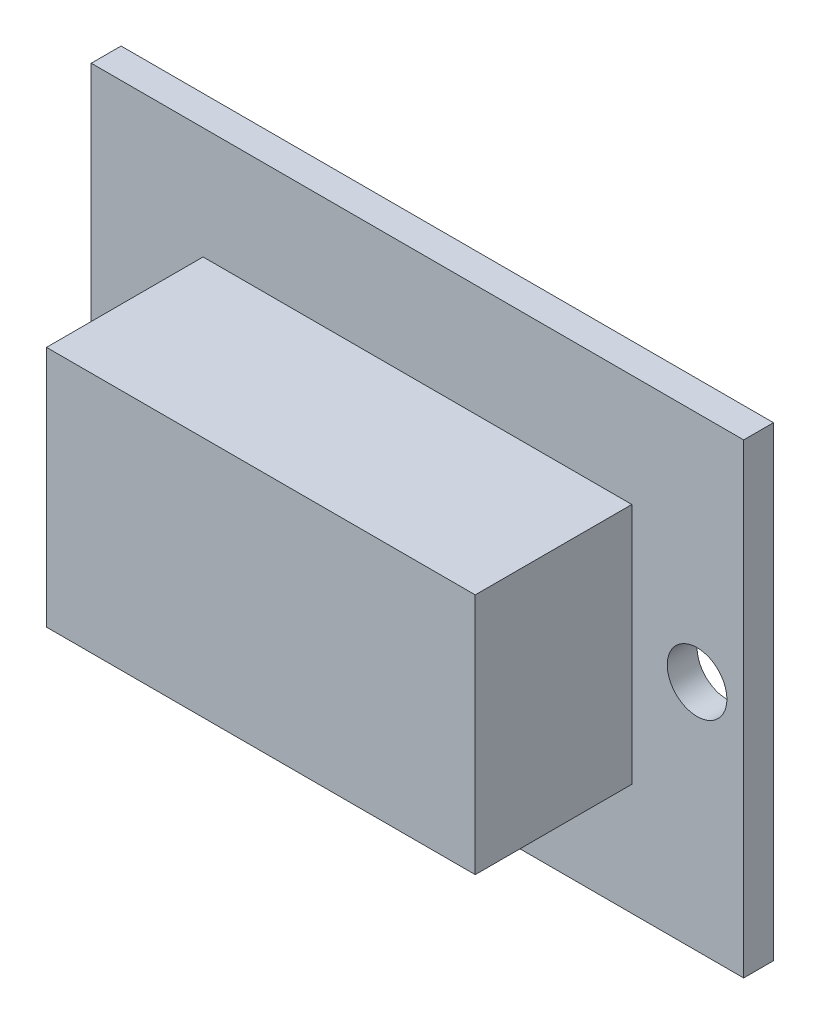
ISO-10303-21;
HEADER;
FILE_DESCRIPTION(('STEP AP214'),'2;1');
FILE_NAME('part.step','',(''),(''),'','','');
FILE_SCHEMA(('AUTOMOTIVE_DESIGN { 1 0 10303 214 1 1 1 1 }'));
ENDSEC;
DATA;
#1=APPLICATION_CONTEXT('core data for automotive mechanical design processes');
#2=APPLICATION_PROTOCOL_DEFINITION('international standard','automotive_design',2000,#1);
#3=PRODUCT_CONTEXT('',#1,'mechanical');
#4=PRODUCT('Part','Part','',(#3));
#5=PRODUCT_RELATED_PRODUCT_CATEGORY('part','',(#4));
#6=PRODUCT_DEFINITION_FORMATION('','',#4);
#7=PRODUCT_DEFINITION_CONTEXT('part definition',#1,'design');
#8=PRODUCT_DEFINITION('design','',#6,#7);
#9=PRODUCT_DEFINITION_SHAPE('','',#8);
#10=(LENGTH_UNIT() NAMED_UNIT(*) SI_UNIT(.MILLI.,.METRE.));
#11=(NAMED_UNIT(*) PLANE_ANGLE_UNIT() SI_UNIT($,.RADIAN.));
#12=(NAMED_UNIT(*) SI_UNIT($,.STERADIAN.) SOLID_ANGLE_UNIT());
#13=UNCERTAINTY_MEASURE_WITH_UNIT(LENGTH_MEASURE(1.E-05),#10,'distance_accuracy_value','');
#14=(GEOMETRIC_REPRESENTATION_CONTEXT(3) GLOBAL_UNCERTAINTY_ASSIGNED_CONTEXT((#13)) GLOBAL_UNIT_ASSIGNED_CONTEXT((#10,
#11,#12)) REPRESENTATION_CONTEXT('',''));
#15=CARTESIAN_POINT('',(0.,0.,0.));
#16=DIRECTION('',(0.,0.,1.));
#17=DIRECTION('',(1.,0.,0.));
#18=AXIS2_PLACEMENT_3D('',#15,#16,#17);
#19=CARTESIAN_POINT('',(-11.5,-6.5,10.));
#20=DIRECTION('',(0.,0.,1.));
#21=DIRECTION('',(1.,0.,0.));
#22=AXIS2_PLACEMENT_3D('',#19,#20,#21);
#23=PLANE('',#22);
#24=DIRECTION('',(0.,1.,0.));
#25=VECTOR('',#24,1.);
#26=CARTESIAN_POINT('',(-11.5,-6.5,10.));
#27=LINE('',#26,#25);
#28=CARTESIAN_POINT('',(-11.5,-6.5,10.));
#29=VERTEX_POINT('',#28);
#30=CARTESIAN_POINT('',(-11.5,6.5,10.));
#31=VERTEX_POINT('',#30);
#32=EDGE_CURVE('E212',#29,#31,#27,.T.);
#33=ORIENTED_EDGE('',*,*,#32,.F.);
#34=DIRECTION('',(1.,0.,0.));
#35=VECTOR('',#34,1.);
#36=CARTESIAN_POINT('',(-11.5,-6.5,10.));
#37=LINE('',#36,#35);
#38=CARTESIAN_POINT('',(11.5,-6.5,10.));
#39=VERTEX_POINT('',#38);
#40=EDGE_CURVE('E145',#29,#39,#37,.T.);
#41=ORIENTED_EDGE('',*,*,#40,.T.);
#42=DIRECTION('',(0.,1.,0.));
#43=VECTOR('',#42,1.);
#44=CARTESIAN_POINT('',(11.5,-6.5,10.));
#45=LINE('',#44,#43);
#46=CARTESIAN_POINT('',(11.5,6.5,10.));
#47=VERTEX_POINT('',#46);
#48=EDGE_CURVE('E46',#39,#47,#45,.T.);
#49=ORIENTED_EDGE('',*,*,#48,.T.);
#50=DIRECTION('',(1.,0.,0.));
#51=VECTOR('',#50,1.);
#52=CARTESIAN_POINT('',(-11.5,6.5,10.));
#53=LINE('',#52,#51);
#54=EDGE_CURVE('E23',#31,#47,#53,.T.);
#55=ORIENTED_EDGE('',*,*,#54,.F.);
#56=EDGE_LOOP('',(#33,#41,#49,#55));
#57=FACE_BOUND('',#56,.T.);
#58=ADVANCED_FACE('F14',(#57),#23,.T.);
#59=CARTESIAN_POINT('',(15.,0.,-2.5));
#60=DIRECTION('',(0.,0.,1.));
#61=DIRECTION('',(1.,0.,0.));
#62=AXIS2_PLACEMENT_3D('',#59,#60,#61);
#63=CYLINDRICAL_SURFACE('',#62,1.6);
#64=DIRECTION('',(0.,0.,1.));
#65=VECTOR('',#64,1.);
#66=CARTESIAN_POINT('',(16.6,0.,-2.5));
#67=LINE('',#66,#65);
#68=CARTESIAN_POINT('',(16.6,0.,0.));
#69=VERTEX_POINT('',#68);
#70=CARTESIAN_POINT('',(16.6,0.,1.6));
#71=VERTEX_POINT('',#70);
#72=EDGE_CURVE('E9',#69,#71,#67,.T.);
#73=ORIENTED_EDGE('',*,*,#72,.F.);
#74=CARTESIAN_POINT('',(15.,0.,0.));
#75=DIRECTION('',(0.,0.,1.));
#76=DIRECTION('',(1.,0.,0.));
#77=AXIS2_PLACEMENT_3D('',#74,#75,#76);
#78=CIRCLE('',#77,1.6);
#79=EDGE_CURVE('E201',#69,#69,#78,.T.);
#80=ORIENTED_EDGE('',*,*,#79,.F.);
#81=ORIENTED_EDGE('',*,*,#72,.T.);
#82=CARTESIAN_POINT('',(15.,0.,1.6));
#83=DIRECTION('',(0.,0.,1.));
#84=DIRECTION('',(1.,0.,0.));
#85=AXIS2_PLACEMENT_3D('',#82,#83,#84);
#86=CIRCLE('',#85,1.6);
#87=EDGE_CURVE('E179',#71,#71,#86,.T.);
#88=ORIENTED_EDGE('',*,*,#87,.T.);
#89=EDGE_LOOP('',(#73,#80,#81,#88));
#90=FACE_BOUND('',#89,.T.);
#91=ADVANCED_FACE('F264',(#90),#63,.F.);
#92=CARTESIAN_POINT('',(-11.5,6.5,1.6));
#93=DIRECTION('',(0.,1.,0.));
#94=DIRECTION('',(1.,0.,0.));
#95=AXIS2_PLACEMENT_3D('',#92,#93,#94);
#96=PLANE('',#95);
#97=DIRECTION('',(1.,0.,0.));
#98=VECTOR('',#97,1.);
#99=CARTESIAN_POINT('',(-11.5,6.5,1.6));
#100=LINE('',#99,#98);
#101=CARTESIAN_POINT('',(-11.5,6.5,1.6));
#102=VERTEX_POINT('',#101);
#103=CARTESIAN_POINT('',(11.5,6.5,1.6));
#104=VERTEX_POINT('',#103);
#105=EDGE_CURVE('E142',#102,#104,#100,.T.);
#106=ORIENTED_EDGE('',*,*,#105,.F.);
#107=DIRECTION('',(0.,0.,1.));
#108=VECTOR('',#107,1.);
#109=CARTESIAN_POINT('',(-11.5,6.5,1.6));
#110=LINE('',#109,#108);
#111=EDGE_CURVE('E209',#102,#31,#110,.T.);
#112=ORIENTED_EDGE('',*,*,#111,.T.);
#113=ORIENTED_EDGE('',*,*,#54,.T.);
#114=DIRECTION('',(0.,0.,1.));
#115=VECTOR('',#114,1.);
#116=CARTESIAN_POINT('',(11.5,6.5,1.6));
#117=LINE('',#116,#115);
#118=EDGE_CURVE('E17',#104,#47,#117,.T.);
#119=ORIENTED_EDGE('',*,*,#118,.F.);
#120=EDGE_LOOP('',(#106,#112,#113,#119));
#121=FACE_BOUND('',#120,.T.);
#122=ADVANCED_FACE('F140',(#121),#96,.T.);
#123=CARTESIAN_POINT('',(11.5,-6.5,1.6));
#124=DIRECTION('',(1.,0.,0.));
#125=DIRECTION('',(0.,1.,0.));
#126=AXIS2_PLACEMENT_3D('',#123,#124,#125);
#127=PLANE('',#126);
#128=DIRECTION('',(0.,0.,1.));
#129=VECTOR('',#128,1.);
#130=CARTESIAN_POINT('',(11.5,-6.5,1.6));
#131=LINE('',#130,#129);
#132=CARTESIAN_POINT('',(11.5,-6.5,1.6));
#133=VERTEX_POINT('',#132);
#134=EDGE_CURVE('E134',#133,#39,#131,.T.);
#135=ORIENTED_EDGE('',*,*,#134,.F.);
#136=DIRECTION('',(0.,1.,0.));
#137=VECTOR('',#136,1.);
#138=CARTESIAN_POINT('',(11.5,-6.5,1.6));
#139=LINE('',#138,#137);
#140=EDGE_CURVE('E147',#133,#104,#139,.T.);
#141=ORIENTED_EDGE('',*,*,#140,.T.);
#142=ORIENTED_EDGE('',*,*,#118,.T.);
#143=ORIENTED_EDGE('',*,*,#48,.F.);
#144=EDGE_LOOP('',(#135,#141,#142,#143));
#145=FACE_BOUND('',#144,.T.);
#146=ADVANCED_FACE('F148',(#145),#127,.T.);
#147=CARTESIAN_POINT('',(-11.5,-6.5,1.6));
#148=DIRECTION('',(0.,1.,0.));
#149=DIRECTION('',(1.,0.,0.));
#150=AXIS2_PLACEMENT_3D('',#147,#148,#149);
#151=PLANE('',#150);
#152=ORIENTED_EDGE('',*,*,#134,.T.);
#153=ORIENTED_EDGE('',*,*,#40,.F.);
#154=DIRECTION('',(0.,0.,1.));
#155=VECTOR('',#154,1.);
#156=CARTESIAN_POINT('',(-11.5,-6.5,1.6));
#157=LINE('',#156,#155);
#158=CARTESIAN_POINT('',(-11.5,-6.5,1.6));
#159=VERTEX_POINT('',#158);
#160=EDGE_CURVE('E205',#159,#29,#157,.T.);
#161=ORIENTED_EDGE('',*,*,#160,.F.);
#162=DIRECTION('',(1.,0.,0.));
#163=VECTOR('',#162,1.);
#164=CARTESIAN_POINT('',(-11.5,-6.5,1.6));
#165=LINE('',#164,#163);
#166=EDGE_CURVE('E152',#159,#133,#165,.T.);
#167=ORIENTED_EDGE('',*,*,#166,.T.);
#168=EDGE_LOOP('',(#152,#153,#161,#167));
#169=FACE_BOUND('',#168,.T.);
#170=ADVANCED_FACE('F248',(#169),#151,.F.);
#171=CARTESIAN_POINT('',(-11.5,-6.5,1.6));
#172=DIRECTION('',(1.,0.,0.));
#173=DIRECTION('',(0.,1.,0.));
#174=AXIS2_PLACEMENT_3D('',#171,#172,#173);
#175=PLANE('',#174);
#176=ORIENTED_EDGE('',*,*,#32,.T.);
#177=ORIENTED_EDGE('',*,*,#111,.F.);
#178=DIRECTION('',(0.,1.,0.));
#179=VECTOR('',#178,1.);
#180=CARTESIAN_POINT('',(-11.5,-6.5,1.6));
#181=LINE('',#180,#179);
#182=EDGE_CURVE('E157',#159,#102,#181,.T.);
#183=ORIENTED_EDGE('',*,*,#182,.F.);
#184=ORIENTED_EDGE('',*,*,#160,.T.);
#185=EDGE_LOOP('',(#176,#177,#183,#184));
#186=FACE_BOUND('',#185,.T.);
#187=ADVANCED_FACE('F244',(#186),#175,.F.);
#188=CARTESIAN_POINT('',(-15.,0.,-2.5));
#189=DIRECTION('',(0.,0.,1.));
#190=DIRECTION('',(1.,0.,0.));
#191=AXIS2_PLACEMENT_3D('',#188,#189,#190);
#192=CYLINDRICAL_SURFACE('',#191,1.6);
#193=DIRECTION('',(0.,0.,1.));
#194=VECTOR('',#193,1.);
#195=CARTESIAN_POINT('',(-13.4,0.,-2.5));
#196=LINE('',#195,#194);
#197=CARTESIAN_POINT('',(-13.4,0.,0.));
#198=VERTEX_POINT('',#197);
#199=CARTESIAN_POINT('',(-13.4,0.,1.6));
#200=VERTEX_POINT('',#199);
#201=EDGE_CURVE('E122',#198,#200,#196,.T.);
#202=ORIENTED_EDGE('',*,*,#201,.F.);
#203=CARTESIAN_POINT('',(-15.,0.,0.));
#204=DIRECTION('',(0.,0.,1.));
#205=DIRECTION('',(1.,0.,0.));
#206=AXIS2_PLACEMENT_3D('',#203,#204,#205);
#207=CIRCLE('',#206,1.6);
#208=EDGE_CURVE('E204',#198,#198,#207,.T.);
#209=ORIENTED_EDGE('',*,*,#208,.F.);
#210=ORIENTED_EDGE('',*,*,#201,.T.);
#211=CARTESIAN_POINT('',(-15.,0.,1.6));
#212=DIRECTION('',(0.,0.,1.));
#213=DIRECTION('',(1.,0.,0.));
#214=AXIS2_PLACEMENT_3D('',#211,#212,#213);
#215=CIRCLE('',#214,1.6);
#216=EDGE_CURVE('E164',#200,#200,#215,.T.);
#217=ORIENTED_EDGE('',*,*,#216,.T.);
#218=EDGE_LOOP('',(#202,#209,#210,#217));
#219=FACE_BOUND('',#218,.T.);
#220=ADVANCED_FACE('F259',(#219),#192,.F.);
#221=CARTESIAN_POINT('',(17.5,-12.5,0.));
#222=DIRECTION('',(1.,0.,0.));
#223=DIRECTION('',(0.,1.,0.));
#224=AXIS2_PLACEMENT_3D('',#221,#222,#223);
#225=PLANE('',#224);
#226=DIRECTION('',(0.,0.,1.));
#227=VECTOR('',#226,1.);
#228=CARTESIAN_POINT('',(17.5,-12.5,0.));
#229=LINE('',#228,#227);
#230=CARTESIAN_POINT('',(17.5,-12.5,0.));
#231=VERTEX_POINT('',#230);
#232=CARTESIAN_POINT('',(17.5,-12.5,1.6));
#233=VERTEX_POINT('',#232);
#234=EDGE_CURVE('E192',#231,#233,#229,.T.);
#235=ORIENTED_EDGE('',*,*,#234,.F.);
#236=DIRECTION('',(0.,1.,0.));
#237=VECTOR('',#236,1.);
#238=CARTESIAN_POINT('',(17.5,-12.5,0.));
#239=LINE('',#238,#237);
#240=CARTESIAN_POINT('',(17.5,12.5,0.));
#241=VERTEX_POINT('',#240);
#242=EDGE_CURVE('E88',#231,#241,#239,.T.);
#243=ORIENTED_EDGE('',*,*,#242,.T.);
#244=DIRECTION('',(0.,0.,1.));
#245=VECTOR('',#244,1.);
#246=CARTESIAN_POINT('',(17.5,12.5,0.));
#247=LINE('',#246,#245);
#248=CARTESIAN_POINT('',(17.5,12.5,1.6));
#249=VERTEX_POINT('',#248);
#250=EDGE_CURVE('E168',#241,#249,#247,.T.);
#251=ORIENTED_EDGE('',*,*,#250,.T.);
#252=DIRECTION('',(0.,1.,0.));
#253=VECTOR('',#252,1.);
#254=CARTESIAN_POINT('',(17.5,-12.5,1.6));
#255=LINE('',#254,#253);
#256=EDGE_CURVE('E75',#233,#249,#255,.T.);
#257=ORIENTED_EDGE('',*,*,#256,.F.);
#258=EDGE_LOOP('',(#235,#243,#251,#257));
#259=FACE_BOUND('',#258,.T.);
#260=ADVANCED_FACE('F274',(#259),#225,.T.);
#261=CARTESIAN_POINT('',(-17.5,-12.5,0.));
#262=DIRECTION('',(0.,0.,1.));
#263=DIRECTION('',(1.,0.,0.));
#264=AXIS2_PLACEMENT_3D('',#261,#262,#263);
#265=PLANE('',#264);
#266=ORIENTED_EDGE('',*,*,#79,.T.);
#267=EDGE_LOOP('',(#266));
#268=FACE_BOUND('',#267,.T.);
#269=ORIENTED_EDGE('',*,*,#208,.T.);
#270=EDGE_LOOP('',(#269));
#271=FACE_BOUND('',#270,.T.);
#272=DIRECTION('',(1.,0.,0.));
#273=VECTOR('',#272,1.);
#274=CARTESIAN_POINT('',(-17.5,12.5,0.));
#275=LINE('',#274,#273);
#276=CARTESIAN_POINT('',(-17.5,12.5,0.));
#277=VERTEX_POINT('',#276);
#278=EDGE_CURVE('E177',#277,#241,#275,.T.);
#279=ORIENTED_EDGE('',*,*,#278,.T.);
#280=ORIENTED_EDGE('',*,*,#242,.F.);
#281=DIRECTION('',(1.,0.,0.));
#282=VECTOR('',#281,1.);
#283=CARTESIAN_POINT('',(-17.5,-12.5,0.));
#284=LINE('',#283,#282);
#285=CARTESIAN_POINT('',(-17.5,-12.5,0.));
#286=VERTEX_POINT('',#285);
#287=EDGE_CURVE('E176',#286,#231,#284,.T.);
#288=ORIENTED_EDGE('',*,*,#287,.F.);
#289=DIRECTION('',(0.,1.,0.));
#290=VECTOR('',#289,1.);
#291=CARTESIAN_POINT('',(-17.5,-12.5,0.));
#292=LINE('',#291,#290);
#293=EDGE_CURVE('E193',#286,#277,#292,.T.);
#294=ORIENTED_EDGE('',*,*,#293,.T.);
#295=EDGE_LOOP('',(#279,#280,#288,#294));
#296=FACE_BOUND('',#295,.T.);
#297=ADVANCED_FACE('F277',(#268,#271,#296),#265,.F.);
#298=CARTESIAN_POINT('',(-17.5,12.5,0.));
#299=DIRECTION('',(0.,1.,0.));
#300=DIRECTION('',(1.,0.,0.));
#301=AXIS2_PLACEMENT_3D('',#298,#299,#300);
#302=PLANE('',#301);
#303=ORIENTED_EDGE('',*,*,#278,.F.);
#304=DIRECTION('',(0.,0.,1.));
#305=VECTOR('',#304,1.);
#306=CARTESIAN_POINT('',(-17.5,12.5,0.));
#307=LINE('',#306,#305);
#308=CARTESIAN_POINT('',(-17.5,12.5,1.6));
#309=VERTEX_POINT('',#308);
#310=EDGE_CURVE('E196',#277,#309,#307,.T.);
#311=ORIENTED_EDGE('',*,*,#310,.T.);
#312=DIRECTION('',(1.,0.,0.));
#313=VECTOR('',#312,1.);
#314=CARTESIAN_POINT('',(-17.5,12.5,1.6));
#315=LINE('',#314,#313);
#316=EDGE_CURVE('E172',#309,#249,#315,.T.);
#317=ORIENTED_EDGE('',*,*,#316,.T.);
#318=ORIENTED_EDGE('',*,*,#250,.F.);
#319=EDGE_LOOP('',(#303,#311,#317,#318));
#320=FACE_BOUND('',#319,.T.);
#321=ADVANCED_FACE('F280',(#320),#302,.T.);
#322=CARTESIAN_POINT('',(-17.5,-12.5,1.6));
#323=DIRECTION('',(0.,0.,1.));
#324=DIRECTION('',(1.,0.,0.));
#325=AXIS2_PLACEMENT_3D('',#322,#323,#324);
#326=PLANE('',#325);
#327=ORIENTED_EDGE('',*,*,#87,.F.);
#328=EDGE_LOOP('',(#327));
#329=FACE_BOUND('',#328,.T.);
#330=ORIENTED_EDGE('',*,*,#182,.T.);
#331=ORIENTED_EDGE('',*,*,#105,.T.);
#332=ORIENTED_EDGE('',*,*,#140,.F.);
#333=ORIENTED_EDGE('',*,*,#166,.F.);
#334=EDGE_LOOP('',(#330,#331,#332,#333));
#335=FACE_BOUND('',#334,.T.);
#336=ORIENTED_EDGE('',*,*,#216,.F.);
#337=EDGE_LOOP('',(#336));
#338=FACE_BOUND('',#337,.T.);
#339=DIRECTION('',(0.,1.,0.));
#340=VECTOR('',#339,1.);
#341=CARTESIAN_POINT('',(-17.5,-12.5,1.6));
#342=LINE('',#341,#340);
#343=CARTESIAN_POINT('',(-17.5,-12.5,1.6));
#344=VERTEX_POINT('',#343);
#345=EDGE_CURVE('E200',#344,#309,#342,.T.);
#346=ORIENTED_EDGE('',*,*,#345,.F.);
#347=DIRECTION('',(1.,0.,0.));
#348=VECTOR('',#347,1.);
#349=CARTESIAN_POINT('',(-17.5,-12.5,1.6));
#350=LINE('',#349,#348);
#351=EDGE_CURVE('E213',#344,#233,#350,.T.);
#352=ORIENTED_EDGE('',*,*,#351,.T.);
#353=ORIENTED_EDGE('',*,*,#256,.T.);
#354=ORIENTED_EDGE('',*,*,#316,.F.);
#355=EDGE_LOOP('',(#346,#352,#353,#354));
#356=FACE_BOUND('',#355,.T.);
#357=ADVANCED_FACE('F154',(#329,#335,#338,#356),#326,.T.);
#358=CARTESIAN_POINT('',(-17.5,-12.5,0.));
#359=DIRECTION('',(0.,1.,0.));
#360=DIRECTION('',(1.,0.,0.));
#361=AXIS2_PLACEMENT_3D('',#358,#359,#360);
#362=PLANE('',#361);
#363=ORIENTED_EDGE('',*,*,#234,.T.);
#364=ORIENTED_EDGE('',*,*,#351,.F.);
#365=DIRECTION('',(0.,0.,1.));
#366=VECTOR('',#365,1.);
#367=CARTESIAN_POINT('',(-17.5,-12.5,0.));
#368=LINE('',#367,#366);
#369=EDGE_CURVE('E189',#286,#344,#368,.T.);
#370=ORIENTED_EDGE('',*,*,#369,.F.);
#371=ORIENTED_EDGE('',*,*,#287,.T.);
#372=EDGE_LOOP('',(#363,#364,#370,#371));
#373=FACE_BOUND('',#372,.T.);
#374=ADVANCED_FACE('F282',(#373),#362,.F.);
#375=CARTESIAN_POINT('',(-17.5,-12.5,0.));
#376=DIRECTION('',(1.,0.,0.));
#377=DIRECTION('',(0.,1.,0.));
#378=AXIS2_PLACEMENT_3D('',#375,#376,#377);
#379=PLANE('',#378);
#380=ORIENTED_EDGE('',*,*,#345,.T.);
#381=ORIENTED_EDGE('',*,*,#310,.F.);
#382=ORIENTED_EDGE('',*,*,#293,.F.);
#383=ORIENTED_EDGE('',*,*,#369,.T.);
#384=EDGE_LOOP('',(#380,#381,#382,#383));
#385=FACE_BOUND('',#384,.T.);
#386=ADVANCED_FACE('F285',(#385),#379,.F.);
#387=CLOSED_SHELL('',(#58,#91,#122,#146,#170,#187,#220,#260,#297,#321,#357,#374,#386));
#388=MANIFOLD_SOLID_BREP('B1',#387);
#389=ADVANCED_BREP_SHAPE_REPRESENTATION('',(#18,#388),#14);
#390=SHAPE_DEFINITION_REPRESENTATION(#9,#389);
ENDSEC;
END-ISO-10303-21;
